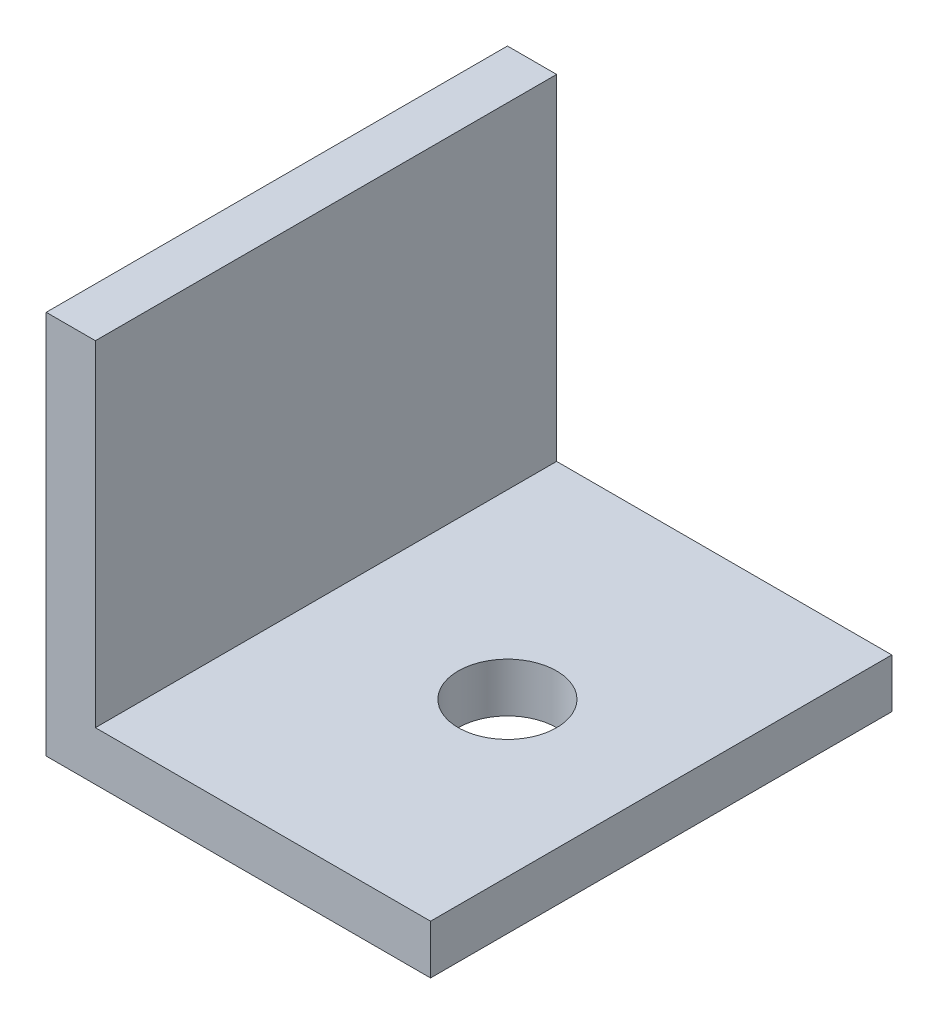
ISO-10303-21;
HEADER;
FILE_DESCRIPTION(('STEP AP214'),'2;1');
FILE_NAME('part.step','',(''),(''),'','','');
FILE_SCHEMA(('AUTOMOTIVE_DESIGN { 1 0 10303 214 1 1 1 1 }'));
ENDSEC;
DATA;
#1=APPLICATION_CONTEXT('core data for automotive mechanical design processes');
#2=APPLICATION_PROTOCOL_DEFINITION('international standard','automotive_design',2000,#1);
#3=PRODUCT_CONTEXT('',#1,'mechanical');
#4=PRODUCT('Part','Part','',(#3));
#5=PRODUCT_RELATED_PRODUCT_CATEGORY('part','',(#4));
#6=PRODUCT_DEFINITION_FORMATION('','',#4);
#7=PRODUCT_DEFINITION_CONTEXT('part definition',#1,'design');
#8=PRODUCT_DEFINITION('design','',#6,#7);
#9=PRODUCT_DEFINITION_SHAPE('','',#8);
#10=(LENGTH_UNIT() NAMED_UNIT(*) SI_UNIT(.MILLI.,.METRE.));
#11=(NAMED_UNIT(*) PLANE_ANGLE_UNIT() SI_UNIT($,.RADIAN.));
#12=(NAMED_UNIT(*) SI_UNIT($,.STERADIAN.) SOLID_ANGLE_UNIT());
#13=UNCERTAINTY_MEASURE_WITH_UNIT(LENGTH_MEASURE(1.E-05),#10,'distance_accuracy_value','');
#14=(GEOMETRIC_REPRESENTATION_CONTEXT(3) GLOBAL_UNCERTAINTY_ASSIGNED_CONTEXT((#13)) GLOBAL_UNIT_ASSIGNED_CONTEXT((#10,
#11,#12)) REPRESENTATION_CONTEXT('',''));
#15=CARTESIAN_POINT('',(0.,0.,0.));
#16=DIRECTION('',(0.,0.,1.));
#17=DIRECTION('',(1.,0.,0.));
#18=AXIS2_PLACEMENT_3D('',#15,#16,#17);
#19=CARTESIAN_POINT('',(12.5,0.,15.));
#20=DIRECTION('',(0.,1.,0.));
#21=DIRECTION('',(-1.,0.,0.));
#22=AXIS2_PLACEMENT_3D('',#19,#20,#21);
#23=PLANE('',#22);
#24=CARTESIAN_POINT('',(7.5,0.,7.5));
#25=DIRECTION('',(0.,1.,0.));
#26=DIRECTION('',(-1.,0.,0.));
#27=AXIS2_PLACEMENT_3D('',#24,#25,#26);
#28=CIRCLE('',#27,1.6);
#29=CARTESIAN_POINT('',(5.9,0.,7.5));
#30=VERTEX_POINT('',#29);
#31=EDGE_CURVE('E121',#30,#30,#28,.T.);
#32=ORIENTED_EDGE('',*,*,#31,.T.);
#33=EDGE_LOOP('',(#32));
#34=FACE_BOUND('',#33,.T.);
#35=DIRECTION('',(1.,0.,0.));
#36=VECTOR('',#35,1.);
#37=CARTESIAN_POINT('',(12.5,0.,0.));
#38=LINE('',#37,#36);
#39=CARTESIAN_POINT('',(0.,0.,0.));
#40=VERTEX_POINT('',#39);
#41=CARTESIAN_POINT('',(12.5,0.,0.));
#42=VERTEX_POINT('',#41);
#43=EDGE_CURVE('E117',#40,#42,#38,.T.);
#44=ORIENTED_EDGE('',*,*,#43,.T.);
#45=DIRECTION('',(0.,0.,-1.));
#46=VECTOR('',#45,1.);
#47=CARTESIAN_POINT('',(12.5,0.,15.));
#48=LINE('',#47,#46);
#49=CARTESIAN_POINT('',(12.5,0.,15.));
#50=VERTEX_POINT('',#49);
#51=EDGE_CURVE('E11',#50,#42,#48,.T.);
#52=ORIENTED_EDGE('',*,*,#51,.F.);
#53=DIRECTION('',(1.,0.,0.));
#54=VECTOR('',#53,1.);
#55=CARTESIAN_POINT('',(12.5,0.,15.));
#56=LINE('',#55,#54);
#57=CARTESIAN_POINT('',(0.,0.,15.));
#58=VERTEX_POINT('',#57);
#59=EDGE_CURVE('E128',#58,#50,#56,.T.);
#60=ORIENTED_EDGE('',*,*,#59,.F.);
#61=DIRECTION('',(0.,0.,-1.));
#62=VECTOR('',#61,1.);
#63=CARTESIAN_POINT('',(0.,0.,15.));
#64=LINE('',#63,#62);
#65=EDGE_CURVE('E113',#58,#40,#64,.T.);
#66=ORIENTED_EDGE('',*,*,#65,.T.);
#67=EDGE_LOOP('',(#44,#52,#60,#66));
#68=FACE_BOUND('',#67,.T.);
#69=ADVANCED_FACE('F33',(#34,#68),#23,.F.);
#70=CARTESIAN_POINT('',(12.5,1.6,15.));
#71=DIRECTION('',(-1.,0.,0.));
#72=DIRECTION('',(0.,-1.,0.));
#73=AXIS2_PLACEMENT_3D('',#70,#71,#72);
#74=PLANE('',#73);
#75=DIRECTION('',(0.,1.,0.));
#76=VECTOR('',#75,1.);
#77=CARTESIAN_POINT('',(12.5,1.6,0.));
#78=LINE('',#77,#76);
#79=CARTESIAN_POINT('',(12.5,1.6,0.));
#80=VERTEX_POINT('',#79);
#81=EDGE_CURVE('E120',#42,#80,#78,.T.);
#82=ORIENTED_EDGE('',*,*,#81,.T.);
#83=DIRECTION('',(0.,0.,-1.));
#84=VECTOR('',#83,1.);
#85=CARTESIAN_POINT('',(12.5,1.6,15.));
#86=LINE('',#85,#84);
#87=CARTESIAN_POINT('',(12.5,1.6,15.));
#88=VERTEX_POINT('',#87);
#89=EDGE_CURVE('E41',#88,#80,#86,.T.);
#90=ORIENTED_EDGE('',*,*,#89,.F.);
#91=DIRECTION('',(0.,1.,0.));
#92=VECTOR('',#91,1.);
#93=CARTESIAN_POINT('',(12.5,1.6,15.));
#94=LINE('',#93,#92);
#95=EDGE_CURVE('E86',#50,#88,#94,.T.);
#96=ORIENTED_EDGE('',*,*,#95,.F.);
#97=ORIENTED_EDGE('',*,*,#51,.T.);
#98=EDGE_LOOP('',(#82,#90,#96,#97));
#99=FACE_BOUND('',#98,.T.);
#100=ADVANCED_FACE('F152',(#99),#74,.F.);
#101=CARTESIAN_POINT('',(1.6,1.6,15.));
#102=DIRECTION('',(0.,-1.,0.));
#103=DIRECTION('',(1.,0.,0.));
#104=AXIS2_PLACEMENT_3D('',#101,#102,#103);
#105=PLANE('',#104);
#106=CARTESIAN_POINT('',(7.5,1.6,7.5));
#107=DIRECTION('',(0.,1.,0.));
#108=DIRECTION('',(-1.,0.,0.));
#109=AXIS2_PLACEMENT_3D('',#106,#107,#108);
#110=CIRCLE('',#109,1.6);
#111=CARTESIAN_POINT('',(5.9,1.6,7.5));
#112=VERTEX_POINT('',#111);
#113=EDGE_CURVE('E160',#112,#112,#110,.T.);
#114=ORIENTED_EDGE('',*,*,#113,.F.);
#115=EDGE_LOOP('',(#114));
#116=FACE_BOUND('',#115,.T.);
#117=DIRECTION('',(-1.,0.,0.));
#118=VECTOR('',#117,1.);
#119=CARTESIAN_POINT('',(1.6,1.6,0.));
#120=LINE('',#119,#118);
#121=CARTESIAN_POINT('',(1.6,1.6,0.));
#122=VERTEX_POINT('',#121);
#123=EDGE_CURVE('E123',#80,#122,#120,.T.);
#124=ORIENTED_EDGE('',*,*,#123,.T.);
#125=DIRECTION('',(0.,0.,-1.));
#126=VECTOR('',#125,1.);
#127=CARTESIAN_POINT('',(1.6,1.6,15.));
#128=LINE('',#127,#126);
#129=CARTESIAN_POINT('',(1.6,1.6,15.));
#130=VERTEX_POINT('',#129);
#131=EDGE_CURVE('E108',#130,#122,#128,.T.);
#132=ORIENTED_EDGE('',*,*,#131,.F.);
#133=DIRECTION('',(-1.,0.,0.));
#134=VECTOR('',#133,1.);
#135=CARTESIAN_POINT('',(1.6,1.6,15.));
#136=LINE('',#135,#134);
#137=EDGE_CURVE('E99',#88,#130,#136,.T.);
#138=ORIENTED_EDGE('',*,*,#137,.F.);
#139=ORIENTED_EDGE('',*,*,#89,.T.);
#140=EDGE_LOOP('',(#124,#132,#138,#139));
#141=FACE_BOUND('',#140,.T.);
#142=ADVANCED_FACE('F134',(#116,#141),#105,.F.);
#143=CARTESIAN_POINT('',(1.6,12.5,15.));
#144=DIRECTION('',(-1.,0.,0.));
#145=DIRECTION('',(0.,-1.,0.));
#146=AXIS2_PLACEMENT_3D('',#143,#144,#145);
#147=PLANE('',#146);
#148=DIRECTION('',(0.,1.,0.));
#149=VECTOR('',#148,1.);
#150=CARTESIAN_POINT('',(1.6,12.5,0.));
#151=LINE('',#150,#149);
#152=CARTESIAN_POINT('',(1.6,12.5,0.));
#153=VERTEX_POINT('',#152);
#154=EDGE_CURVE('E107',#122,#153,#151,.T.);
#155=ORIENTED_EDGE('',*,*,#154,.T.);
#156=DIRECTION('',(0.,0.,-1.));
#157=VECTOR('',#156,1.);
#158=CARTESIAN_POINT('',(1.6,12.5,15.));
#159=LINE('',#158,#157);
#160=CARTESIAN_POINT('',(1.6,12.5,15.));
#161=VERTEX_POINT('',#160);
#162=EDGE_CURVE('E104',#161,#153,#159,.T.);
#163=ORIENTED_EDGE('',*,*,#162,.F.);
#164=DIRECTION('',(0.,1.,0.));
#165=VECTOR('',#164,1.);
#166=CARTESIAN_POINT('',(1.6,12.5,15.));
#167=LINE('',#166,#165);
#168=EDGE_CURVE('E93',#130,#161,#167,.T.);
#169=ORIENTED_EDGE('',*,*,#168,.F.);
#170=ORIENTED_EDGE('',*,*,#131,.T.);
#171=EDGE_LOOP('',(#155,#163,#169,#170));
#172=FACE_BOUND('',#171,.T.);
#173=ADVANCED_FACE('F105',(#172),#147,.F.);
#174=CARTESIAN_POINT('',(0.,12.5,15.));
#175=DIRECTION('',(0.,-1.,0.));
#176=DIRECTION('',(0.,0.,-1.));
#177=AXIS2_PLACEMENT_3D('',#174,#175,#176);
#178=PLANE('',#177);
#179=DIRECTION('',(-1.,0.,0.));
#180=VECTOR('',#179,1.);
#181=CARTESIAN_POINT('',(0.,12.5,0.));
#182=LINE('',#181,#180);
#183=CARTESIAN_POINT('',(0.,12.5,0.));
#184=VERTEX_POINT('',#183);
#185=EDGE_CURVE('E72',#153,#184,#182,.T.);
#186=ORIENTED_EDGE('',*,*,#185,.T.);
#187=DIRECTION('',(0.,0.,-1.));
#188=VECTOR('',#187,1.);
#189=CARTESIAN_POINT('',(0.,12.5,15.));
#190=LINE('',#189,#188);
#191=CARTESIAN_POINT('',(0.,12.5,15.));
#192=VERTEX_POINT('',#191);
#193=EDGE_CURVE('E109',#192,#184,#190,.T.);
#194=ORIENTED_EDGE('',*,*,#193,.F.);
#195=DIRECTION('',(-1.,0.,0.));
#196=VECTOR('',#195,1.);
#197=CARTESIAN_POINT('',(0.,12.5,15.));
#198=LINE('',#197,#196);
#199=EDGE_CURVE('E97',#161,#192,#198,.T.);
#200=ORIENTED_EDGE('',*,*,#199,.F.);
#201=ORIENTED_EDGE('',*,*,#162,.T.);
#202=EDGE_LOOP('',(#186,#194,#200,#201));
#203=FACE_BOUND('',#202,.T.);
#204=ADVANCED_FACE('F111',(#203),#178,.F.);
#205=CARTESIAN_POINT('',(0.,0.,15.));
#206=DIRECTION('',(1.,0.,0.));
#207=DIRECTION('',(0.,0.,-1.));
#208=AXIS2_PLACEMENT_3D('',#205,#206,#207);
#209=PLANE('',#208);
#210=DIRECTION('',(0.,-1.,0.));
#211=VECTOR('',#210,1.);
#212=CARTESIAN_POINT('',(0.,0.,0.));
#213=LINE('',#212,#211);
#214=EDGE_CURVE('E78',#184,#40,#213,.T.);
#215=ORIENTED_EDGE('',*,*,#214,.T.);
#216=ORIENTED_EDGE('',*,*,#65,.F.);
#217=DIRECTION('',(0.,-1.,0.));
#218=VECTOR('',#217,1.);
#219=CARTESIAN_POINT('',(0.,0.,15.));
#220=LINE('',#219,#218);
#221=EDGE_CURVE('E49',#192,#58,#220,.T.);
#222=ORIENTED_EDGE('',*,*,#221,.F.);
#223=ORIENTED_EDGE('',*,*,#193,.T.);
#224=EDGE_LOOP('',(#215,#216,#222,#223));
#225=FACE_BOUND('',#224,.T.);
#226=ADVANCED_FACE('F141',(#225),#209,.F.);
#227=CARTESIAN_POINT('',(0.,0.,15.));
#228=DIRECTION('',(0.,0.,-1.));
#229=DIRECTION('',(-1.,0.,0.));
#230=AXIS2_PLACEMENT_3D('',#227,#228,#229);
#231=PLANE('',#230);
#232=ORIENTED_EDGE('',*,*,#59,.T.);
#233=ORIENTED_EDGE('',*,*,#95,.T.);
#234=ORIENTED_EDGE('',*,*,#137,.T.);
#235=ORIENTED_EDGE('',*,*,#168,.T.);
#236=ORIENTED_EDGE('',*,*,#199,.T.);
#237=ORIENTED_EDGE('',*,*,#221,.T.);
#238=EDGE_LOOP('',(#232,#233,#234,#235,#236,#237));
#239=FACE_BOUND('',#238,.T.);
#240=ADVANCED_FACE('F95',(#239),#231,.F.);
#241=CARTESIAN_POINT('',(0.,0.,0.));
#242=DIRECTION('',(0.,0.,-1.));
#243=DIRECTION('',(-1.,0.,0.));
#244=AXIS2_PLACEMENT_3D('',#241,#242,#243);
#245=PLANE('',#244);
#246=ORIENTED_EDGE('',*,*,#43,.F.);
#247=ORIENTED_EDGE('',*,*,#214,.F.);
#248=ORIENTED_EDGE('',*,*,#185,.F.);
#249=ORIENTED_EDGE('',*,*,#154,.F.);
#250=ORIENTED_EDGE('',*,*,#123,.F.);
#251=ORIENTED_EDGE('',*,*,#81,.F.);
#252=EDGE_LOOP('',(#246,#247,#248,#249,#250,#251));
#253=FACE_BOUND('',#252,.T.);
#254=ADVANCED_FACE('F137',(#253),#245,.T.);
#255=CARTESIAN_POINT('',(7.5,0.,7.5));
#256=DIRECTION('',(0.,1.,0.));
#257=DIRECTION('',(-1.,0.,0.));
#258=AXIS2_PLACEMENT_3D('',#255,#256,#257);
#259=CYLINDRICAL_SURFACE('',#258,1.6);
#260=ORIENTED_EDGE('',*,*,#31,.F.);
#261=EDGE_LOOP('',(#260));
#262=FACE_BOUND('',#261,.T.);
#263=ORIENTED_EDGE('',*,*,#113,.T.);
#264=EDGE_LOOP('',(#263));
#265=FACE_BOUND('',#264,.T.);
#266=ADVANCED_FACE('F168',(#262,#265),#259,.F.);
#267=CLOSED_SHELL('',(#69,#100,#142,#173,#204,#226,#240,#254,#266));
#268=MANIFOLD_SOLID_BREP('B2',#267);
#269=ADVANCED_BREP_SHAPE_REPRESENTATION('',(#18,#268),#14);
#270=SHAPE_DEFINITION_REPRESENTATION(#9,#269);
ENDSEC;
END-ISO-10303-21;
